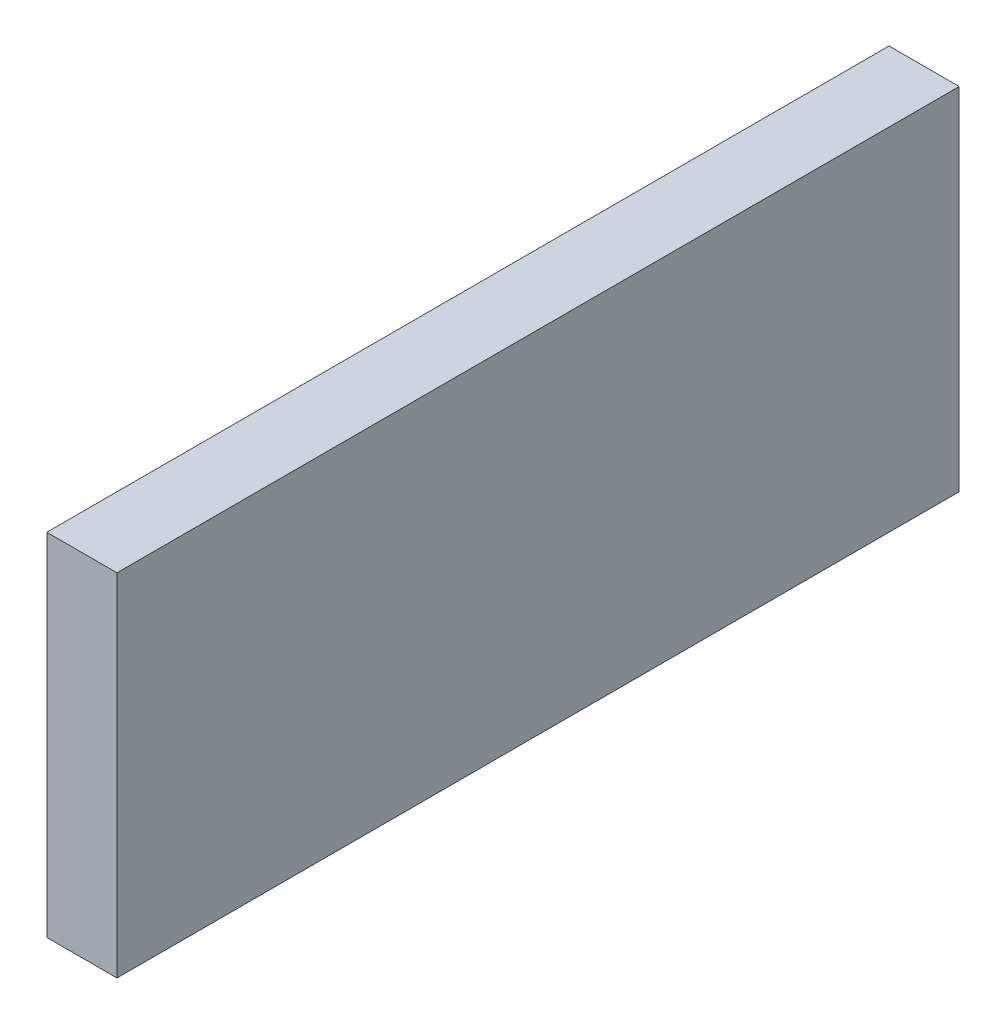
ISO-10303-21;
HEADER;
FILE_DESCRIPTION(('STEP AP214'),'2;1');
FILE_NAME('part.step','',(''),(''),'','','');
FILE_SCHEMA(('AUTOMOTIVE_DESIGN { 1 0 10303 214 1 1 1 1 }'));
ENDSEC;
DATA;
#1=APPLICATION_CONTEXT('core data for automotive mechanical design processes');
#2=APPLICATION_PROTOCOL_DEFINITION('international standard','automotive_design',2000,#1);
#3=PRODUCT_CONTEXT('',#1,'mechanical');
#4=PRODUCT('Part','Part','',(#3));
#5=PRODUCT_RELATED_PRODUCT_CATEGORY('part','',(#4));
#6=PRODUCT_DEFINITION_FORMATION('','',#4);
#7=PRODUCT_DEFINITION_CONTEXT('part definition',#1,'design');
#8=PRODUCT_DEFINITION('design','',#6,#7);
#9=PRODUCT_DEFINITION_SHAPE('','',#8);
#10=(LENGTH_UNIT() NAMED_UNIT(*) SI_UNIT(.MILLI.,.METRE.));
#11=(NAMED_UNIT(*) PLANE_ANGLE_UNIT() SI_UNIT($,.RADIAN.));
#12=(NAMED_UNIT(*) SI_UNIT($,.STERADIAN.) SOLID_ANGLE_UNIT());
#13=UNCERTAINTY_MEASURE_WITH_UNIT(LENGTH_MEASURE(1.E-05),#10,'distance_accuracy_value','');
#14=(GEOMETRIC_REPRESENTATION_CONTEXT(3) GLOBAL_UNCERTAINTY_ASSIGNED_CONTEXT((#13)) GLOBAL_UNIT_ASSIGNED_CONTEXT((#10,
#11,#12)) REPRESENTATION_CONTEXT('',''));
#15=CARTESIAN_POINT('',(0.,0.,0.));
#16=DIRECTION('',(0.,0.,1.));
#17=DIRECTION('',(1.,0.,0.));
#18=AXIS2_PLACEMENT_3D('',#15,#16,#17);
#19=CARTESIAN_POINT('',(0.,100.,0.));
#20=DIRECTION('',(1.,0.,0.));
#21=DIRECTION('',(0.,0.,-1.));
#22=AXIS2_PLACEMENT_3D('',#19,#20,#21);
#23=PLANE('',#22);
#24=DIRECTION('',(0.,0.,1.));
#25=VECTOR('',#24,1.);
#26=CARTESIAN_POINT('',(0.,0.,0.));
#27=LINE('',#26,#25);
#28=CARTESIAN_POINT('',(0.,0.,0.));
#29=VERTEX_POINT('',#28);
#30=CARTESIAN_POINT('',(0.,0.,240.));
#31=VERTEX_POINT('',#30);
#32=EDGE_CURVE('E107',#29,#31,#27,.T.);
#33=ORIENTED_EDGE('',*,*,#32,.T.);
#34=DIRECTION('',(0.,-1.,0.));
#35=VECTOR('',#34,1.);
#36=CARTESIAN_POINT('',(0.,100.,240.));
#37=LINE('',#36,#35);
#38=CARTESIAN_POINT('',(0.,100.,240.));
#39=VERTEX_POINT('',#38);
#40=EDGE_CURVE('E11',#39,#31,#37,.T.);
#41=ORIENTED_EDGE('',*,*,#40,.F.);
#42=DIRECTION('',(0.,0.,1.));
#43=VECTOR('',#42,1.);
#44=CARTESIAN_POINT('',(0.,100.,0.));
#45=LINE('',#44,#43);
#46=CARTESIAN_POINT('',(0.,100.,0.));
#47=VERTEX_POINT('',#46);
#48=EDGE_CURVE('E91',#47,#39,#45,.T.);
#49=ORIENTED_EDGE('',*,*,#48,.F.);
#50=DIRECTION('',(0.,-1.,0.));
#51=VECTOR('',#50,1.);
#52=CARTESIAN_POINT('',(0.,100.,0.));
#53=LINE('',#52,#51);
#54=EDGE_CURVE('E103',#47,#29,#53,.T.);
#55=ORIENTED_EDGE('',*,*,#54,.T.);
#56=EDGE_LOOP('',(#33,#41,#49,#55));
#57=FACE_BOUND('',#56,.T.);
#58=ADVANCED_FACE('F39',(#57),#23,.F.);
#59=CARTESIAN_POINT('',(0.,100.,240.));
#60=DIRECTION('',(0.,0.,-1.));
#61=DIRECTION('',(-1.,0.,0.));
#62=AXIS2_PLACEMENT_3D('',#59,#60,#61);
#63=PLANE('',#62);
#64=DIRECTION('',(1.,0.,0.));
#65=VECTOR('',#64,1.);
#66=CARTESIAN_POINT('',(0.,0.,240.));
#67=LINE('',#66,#65);
#68=CARTESIAN_POINT('',(20.0000000000001,0.,240.));
#69=VERTEX_POINT('',#68);
#70=EDGE_CURVE('E96',#31,#69,#67,.T.);
#71=ORIENTED_EDGE('',*,*,#70,.T.);
#72=DIRECTION('',(0.,-1.,0.));
#73=VECTOR('',#72,1.);
#74=CARTESIAN_POINT('',(20.0000000000001,100.,240.));
#75=LINE('',#74,#73);
#76=CARTESIAN_POINT('',(20.0000000000001,100.,240.));
#77=VERTEX_POINT('',#76);
#78=EDGE_CURVE('E48',#77,#69,#75,.T.);
#79=ORIENTED_EDGE('',*,*,#78,.F.);
#80=DIRECTION('',(1.,0.,0.));
#81=VECTOR('',#80,1.);
#82=CARTESIAN_POINT('',(0.,100.,240.));
#83=LINE('',#82,#81);
#84=EDGE_CURVE('E86',#39,#77,#83,.T.);
#85=ORIENTED_EDGE('',*,*,#84,.F.);
#86=ORIENTED_EDGE('',*,*,#40,.T.);
#87=EDGE_LOOP('',(#71,#79,#85,#86));
#88=FACE_BOUND('',#87,.T.);
#89=ADVANCED_FACE('F95',(#88),#63,.F.);
#90=CARTESIAN_POINT('',(20.,100.,0.));
#91=DIRECTION('',(-1.,0.,0.));
#92=DIRECTION('',(0.,0.,1.));
#93=AXIS2_PLACEMENT_3D('',#90,#91,#92);
#94=PLANE('',#93);
#95=DIRECTION('',(0.,0.,-1.));
#96=VECTOR('',#95,1.);
#97=CARTESIAN_POINT('',(20.,0.,0.));
#98=LINE('',#97,#96);
#99=CARTESIAN_POINT('',(20.,0.,0.));
#100=VERTEX_POINT('',#99);
#101=EDGE_CURVE('E73',#69,#100,#98,.T.);
#102=ORIENTED_EDGE('',*,*,#101,.T.);
#103=DIRECTION('',(0.,-1.,0.));
#104=VECTOR('',#103,1.);
#105=CARTESIAN_POINT('',(20.,100.,0.));
#106=LINE('',#105,#104);
#107=CARTESIAN_POINT('',(20.,100.,0.));
#108=VERTEX_POINT('',#107);
#109=EDGE_CURVE('E98',#108,#100,#106,.T.);
#110=ORIENTED_EDGE('',*,*,#109,.F.);
#111=DIRECTION('',(0.,0.,-1.));
#112=VECTOR('',#111,1.);
#113=CARTESIAN_POINT('',(20.,100.,0.));
#114=LINE('',#113,#112);
#115=EDGE_CURVE('E89',#77,#108,#114,.T.);
#116=ORIENTED_EDGE('',*,*,#115,.F.);
#117=ORIENTED_EDGE('',*,*,#78,.T.);
#118=EDGE_LOOP('',(#102,#110,#116,#117));
#119=FACE_BOUND('',#118,.T.);
#120=ADVANCED_FACE('F99',(#119),#94,.F.);
#121=CARTESIAN_POINT('',(0.,100.,0.));
#122=DIRECTION('',(0.,0.,1.));
#123=DIRECTION('',(1.,0.,0.));
#124=AXIS2_PLACEMENT_3D('',#121,#122,#123);
#125=PLANE('',#124);
#126=DIRECTION('',(-1.,0.,0.));
#127=VECTOR('',#126,1.);
#128=CARTESIAN_POINT('',(0.,0.,0.));
#129=LINE('',#128,#127);
#130=EDGE_CURVE('E79',#100,#29,#129,.T.);
#131=ORIENTED_EDGE('',*,*,#130,.T.);
#132=ORIENTED_EDGE('',*,*,#54,.F.);
#133=DIRECTION('',(-1.,0.,0.));
#134=VECTOR('',#133,1.);
#135=CARTESIAN_POINT('',(0.,100.,0.));
#136=LINE('',#135,#134);
#137=EDGE_CURVE('E56',#108,#47,#136,.T.);
#138=ORIENTED_EDGE('',*,*,#137,.F.);
#139=ORIENTED_EDGE('',*,*,#109,.T.);
#140=EDGE_LOOP('',(#131,#132,#138,#139));
#141=FACE_BOUND('',#140,.T.);
#142=ADVANCED_FACE('F120',(#141),#125,.F.);
#143=CARTESIAN_POINT('',(0.,100.,0.));
#144=DIRECTION('',(0.,1.,0.));
#145=DIRECTION('',(0.,0.,1.));
#146=AXIS2_PLACEMENT_3D('',#143,#144,#145);
#147=PLANE('',#146);
#148=ORIENTED_EDGE('',*,*,#48,.T.);
#149=ORIENTED_EDGE('',*,*,#84,.T.);
#150=ORIENTED_EDGE('',*,*,#115,.T.);
#151=ORIENTED_EDGE('',*,*,#137,.T.);
#152=EDGE_LOOP('',(#148,#149,#150,#151));
#153=FACE_BOUND('',#152,.T.);
#154=ADVANCED_FACE('F87',(#153),#147,.T.);
#155=CARTESIAN_POINT('',(0.,0.,0.));
#156=DIRECTION('',(0.,1.,0.));
#157=DIRECTION('',(0.,0.,1.));
#158=AXIS2_PLACEMENT_3D('',#155,#156,#157);
#159=PLANE('',#158);
#160=ORIENTED_EDGE('',*,*,#32,.F.);
#161=ORIENTED_EDGE('',*,*,#130,.F.);
#162=ORIENTED_EDGE('',*,*,#101,.F.);
#163=ORIENTED_EDGE('',*,*,#70,.F.);
#164=EDGE_LOOP('',(#160,#161,#162,#163));
#165=FACE_BOUND('',#164,.T.);
#166=ADVANCED_FACE('F123',(#165),#159,.F.);
#167=CLOSED_SHELL('',(#58,#89,#120,#142,#154,#166));
#168=MANIFOLD_SOLID_BREP('B2',#167);
#169=ADVANCED_BREP_SHAPE_REPRESENTATION('',(#18,#168),#14);
#170=SHAPE_DEFINITION_REPRESENTATION(#9,#169);
ENDSEC;
END-ISO-10303-21;
